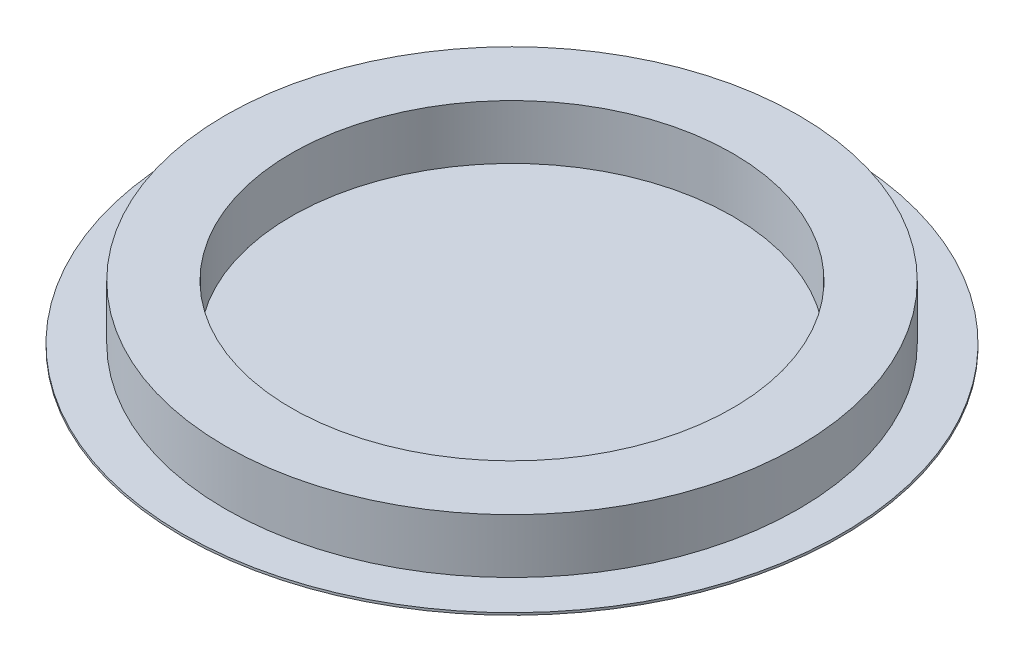
ISO-10303-21;
HEADER;
FILE_DESCRIPTION(('STEP AP214'),'2;1');
FILE_NAME('part.step','',(''),(''),'','','');
FILE_SCHEMA(('AUTOMOTIVE_DESIGN { 1 0 10303 214 1 1 1 1 }'));
ENDSEC;
DATA;
#1=APPLICATION_CONTEXT('core data for automotive mechanical design processes');
#2=APPLICATION_PROTOCOL_DEFINITION('international standard','automotive_design',2000,#1);
#3=PRODUCT_CONTEXT('',#1,'mechanical');
#4=PRODUCT('Part','Part','',(#3));
#5=PRODUCT_RELATED_PRODUCT_CATEGORY('part','',(#4));
#6=PRODUCT_DEFINITION_FORMATION('','',#4);
#7=PRODUCT_DEFINITION_CONTEXT('part definition',#1,'design');
#8=PRODUCT_DEFINITION('design','',#6,#7);
#9=PRODUCT_DEFINITION_SHAPE('','',#8);
#10=(LENGTH_UNIT() NAMED_UNIT(*) SI_UNIT(.MILLI.,.METRE.));
#11=(NAMED_UNIT(*) PLANE_ANGLE_UNIT() SI_UNIT($,.RADIAN.));
#12=(NAMED_UNIT(*) SI_UNIT($,.STERADIAN.) SOLID_ANGLE_UNIT());
#13=UNCERTAINTY_MEASURE_WITH_UNIT(LENGTH_MEASURE(1.E-05),#10,'distance_accuracy_value','');
#14=(GEOMETRIC_REPRESENTATION_CONTEXT(3) GLOBAL_UNCERTAINTY_ASSIGNED_CONTEXT((#13)) GLOBAL_UNIT_ASSIGNED_CONTEXT((#10,
#11,#12)) REPRESENTATION_CONTEXT('',''));
#15=CARTESIAN_POINT('',(0.,0.,0.));
#16=DIRECTION('',(0.,0.,1.));
#17=DIRECTION('',(1.,0.,0.));
#18=AXIS2_PLACEMENT_3D('',#15,#16,#17);
#19=CARTESIAN_POINT('',(0.,0.08,0.));
#20=DIRECTION('',(0.,-1.,0.));
#21=DIRECTION('',(0.,0.,-1.));
#22=AXIS2_PLACEMENT_3D('',#19,#20,#21);
#23=CYLINDRICAL_SURFACE('',#22,11.5);
#24=CARTESIAN_POINT('',(0.,0.08,0.));
#25=DIRECTION('',(0.,1.,0.));
#26=DIRECTION('',(0.,0.,1.));
#27=AXIS2_PLACEMENT_3D('',#24,#25,#26);
#28=CIRCLE('',#27,11.5);
#29=CARTESIAN_POINT('',(0.,0.08,-11.5));
#30=VERTEX_POINT('',#29);
#31=EDGE_CURVE('E45',#30,#30,#28,.T.);
#32=CARTESIAN_POINT('',(0.,0.,0.));
#33=DIRECTION('',(0.,1.,0.));
#34=DIRECTION('',(0.,0.,1.));
#35=AXIS2_PLACEMENT_3D('',#32,#33,#34);
#36=CIRCLE('',#35,11.5);
#37=CARTESIAN_POINT('',(0.,0.,-11.5));
#38=VERTEX_POINT('',#37);
#39=EDGE_CURVE('E49',#38,#38,#36,.T.);
#40=CARTESIAN_POINT('',(0.,0.08,-11.5));
#41=CARTESIAN_POINT('',(0.,0.0791666666666667,-11.5));
#42=CARTESIAN_POINT('',(0.,0.0783333333333333,-11.5));
#43=CARTESIAN_POINT('',(0.,0.0766666666666667,-11.5));
#44=CARTESIAN_POINT('',(0.,0.0758333333333333,-11.5));
#45=CARTESIAN_POINT('',(0.,0.0741666666666667,-11.5));
#46=CARTESIAN_POINT('',(0.,0.0733333333333333,-11.5));
#47=CARTESIAN_POINT('',(0.,0.0716666666666667,-11.5));
#48=CARTESIAN_POINT('',(0.,0.0708333333333333,-11.5));
#49=CARTESIAN_POINT('',(0.,0.0691666666666667,-11.5));
#50=CARTESIAN_POINT('',(0.,0.0683333333333333,-11.5));
#51=CARTESIAN_POINT('',(0.,0.0666666666666667,-11.5));
#52=CARTESIAN_POINT('',(0.,0.0658333333333333,-11.5));
#53=CARTESIAN_POINT('',(0.,0.0641666666666667,-11.5));
#54=CARTESIAN_POINT('',(0.,0.0633333333333333,-11.5));
#55=CARTESIAN_POINT('',(0.,0.0616666666666667,-11.5));
#56=CARTESIAN_POINT('',(0.,0.0608333333333333,-11.5));
#57=CARTESIAN_POINT('',(0.,0.0591666666666667,-11.5));
#58=CARTESIAN_POINT('',(0.,0.0583333333333333,-11.5));
#59=CARTESIAN_POINT('',(0.,0.0566666666666667,-11.5));
#60=CARTESIAN_POINT('',(0.,0.0558333333333333,-11.5));
#61=CARTESIAN_POINT('',(0.,0.0541666666666667,-11.5));
#62=CARTESIAN_POINT('',(0.,0.0533333333333333,-11.5));
#63=CARTESIAN_POINT('',(0.,0.0516666666666667,-11.5));
#64=CARTESIAN_POINT('',(0.,0.0508333333333333,-11.5));
#65=CARTESIAN_POINT('',(0.,0.0491666666666667,-11.5));
#66=CARTESIAN_POINT('',(0.,0.0483333333333333,-11.5));
#67=CARTESIAN_POINT('',(0.,0.0466666666666667,-11.5));
#68=CARTESIAN_POINT('',(0.,0.0458333333333333,-11.5));
#69=CARTESIAN_POINT('',(0.,0.0441666666666667,-11.5));
#70=CARTESIAN_POINT('',(0.,0.0433333333333333,-11.5));
#71=CARTESIAN_POINT('',(0.,0.0416666666666667,-11.5));
#72=CARTESIAN_POINT('',(0.,0.0408333333333333,-11.5));
#73=CARTESIAN_POINT('',(0.,0.0391666666666667,-11.5));
#74=CARTESIAN_POINT('',(0.,0.0383333333333333,-11.5));
#75=CARTESIAN_POINT('',(0.,0.0366666666666667,-11.5));
#76=CARTESIAN_POINT('',(0.,0.0358333333333333,-11.5));
#77=CARTESIAN_POINT('',(0.,0.0341666666666667,-11.5));
#78=CARTESIAN_POINT('',(0.,0.0333333333333333,-11.5));
#79=CARTESIAN_POINT('',(0.,0.0316666666666667,-11.5));
#80=CARTESIAN_POINT('',(0.,0.0308333333333333,-11.5));
#81=CARTESIAN_POINT('',(0.,0.0291666666666667,-11.5));
#82=CARTESIAN_POINT('',(0.,0.0283333333333333,-11.5));
#83=CARTESIAN_POINT('',(0.,0.0266666666666667,-11.5));
#84=CARTESIAN_POINT('',(0.,0.0258333333333333,-11.5));
#85=CARTESIAN_POINT('',(0.,0.0241666666666667,-11.5));
#86=CARTESIAN_POINT('',(0.,0.0233333333333333,-11.5));
#87=CARTESIAN_POINT('',(0.,0.0216666666666667,-11.5));
#88=CARTESIAN_POINT('',(0.,0.0208333333333333,-11.5));
#89=CARTESIAN_POINT('',(0.,0.0191666666666667,-11.5));
#90=CARTESIAN_POINT('',(0.,0.0183333333333333,-11.5));
#91=CARTESIAN_POINT('',(0.,0.0166666666666667,-11.5));
#92=CARTESIAN_POINT('',(0.,0.0158333333333333,-11.5));
#93=CARTESIAN_POINT('',(0.,0.0141666666666667,-11.5));
#94=CARTESIAN_POINT('',(0.,0.0133333333333333,-11.5));
#95=CARTESIAN_POINT('',(0.,0.0116666666666667,-11.5));
#96=CARTESIAN_POINT('',(0.,0.0108333333333333,-11.5));
#97=CARTESIAN_POINT('',(0.,0.00916666666666667,-11.5));
#98=CARTESIAN_POINT('',(0.,0.00833333333333334,-11.5));
#99=CARTESIAN_POINT('',(0.,0.00666666666666667,-11.5));
#100=CARTESIAN_POINT('',(0.,0.00583333333333333,-11.5));
#101=CARTESIAN_POINT('',(0.,0.00416666666666667,-11.5));
#102=CARTESIAN_POINT('',(0.,0.00333333333333334,-11.5));
#103=CARTESIAN_POINT('',(0.,0.00166666666666667,-11.5));
#104=CARTESIAN_POINT('',(0.,0.000833333333333335,-11.5));
#105=CARTESIAN_POINT('',(0.,0.,-11.5));
#106=B_SPLINE_CURVE_WITH_KNOTS('',3,(#40,#41,#42,#43,#44,#45,#46,#47,#48,#49,#50,#51,#52,#53,
#54,#55,#56,#57,#58,#59,#60,#61,#62,#63,#64,#65,#66,#67,#68,#69,#70,#71,#72,#73,#74,#75,#76,#77,
#78,#79,#80,#81,#82,#83,#84,#85,#86,#87,#88,#89,#90,#91,#92,#93,#94,#95,#96,#97,#98,#99,#100,
#101,#102,#103,#104,#105),.UNSPECIFIED.,.F.,.F.,(4,2,2,2,2,2,2,2,2,2,2,2,2,2,2,2,2,2,2,2,2,2,2,
2,2,2,2,2,2,2,2,2,4),(0.,0.00250000000000001,0.00500000000000001,0.00750000000000001,0.01,
0.0125,0.015,0.0175,0.02,0.0225,0.025,0.0275,0.03,0.0325,0.035,0.0375,0.04,0.0425,0.045,0.0475,
0.05,0.0525,0.055,0.0575,0.06,0.0625,0.065,0.0675,0.07,0.0725,0.075,0.0775,0.08),.UNSPECIFIED.);
#107=EDGE_CURVE('BSEAM39',#30,#38,#106,.T.);
#108=ORIENTED_EDGE('',*,*,#31,.F.);
#109=ORIENTED_EDGE('',*,*,#39,.T.);
#110=ORIENTED_EDGE('',*,*,#107,.T.);
#111=ORIENTED_EDGE('',*,*,#107,.F.);
#112=EDGE_LOOP('',(#108,#110,#109,#111));
#113=FACE_BOUND('',#112,.T.);
#114=ADVANCED_FACE('F39',(#113),#23,.T.);
#115=CARTESIAN_POINT('',(0.,0.08,0.));
#116=DIRECTION('',(0.,1.,0.));
#117=DIRECTION('',(0.,0.,1.));
#118=AXIS2_PLACEMENT_3D('',#115,#116,#117);
#119=PLANE('',#118);
#120=CARTESIAN_POINT('',(0.,0.08,0.));
#121=DIRECTION('',(0.,1.,0.));
#122=DIRECTION('',(0.,0.,1.));
#123=AXIS2_PLACEMENT_3D('',#120,#121,#122);
#124=CIRCLE('',#123,10.);
#125=CARTESIAN_POINT('',(0.,0.08,-10.));
#126=VERTEX_POINT('',#125);
#127=EDGE_CURVE('E56',#126,#126,#124,.T.);
#128=ORIENTED_EDGE('',*,*,#127,.F.);
#129=EDGE_LOOP('',(#128));
#130=FACE_BOUND('',#129,.T.);
#131=ORIENTED_EDGE('',*,*,#31,.T.);
#132=EDGE_LOOP('',(#131));
#133=FACE_BOUND('',#132,.T.);
#134=ADVANCED_FACE('F80',(#130,#133),#119,.T.);
#135=CARTESIAN_POINT('',(0.,0.,0.));
#136=DIRECTION('',(0.,1.,0.));
#137=DIRECTION('',(0.,0.,1.));
#138=AXIS2_PLACEMENT_3D('',#135,#136,#137);
#139=PLANE('',#138);
#140=ORIENTED_EDGE('',*,*,#39,.F.);
#141=EDGE_LOOP('',(#140));
#142=FACE_BOUND('',#141,.T.);
#143=ADVANCED_FACE('F70',(#142),#139,.F.);
#144=CARTESIAN_POINT('',(0.,1.98,0.));
#145=DIRECTION('',(0.,1.,0.));
#146=DIRECTION('',(0.,0.,1.));
#147=AXIS2_PLACEMENT_3D('',#144,#145,#146);
#148=PLANE('',#147);
#149=CARTESIAN_POINT('',(0.,1.98,0.));
#150=DIRECTION('',(0.,1.,0.));
#151=DIRECTION('',(0.,0.,1.));
#152=AXIS2_PLACEMENT_3D('',#149,#150,#151);
#153=CIRCLE('',#152,10.);
#154=CARTESIAN_POINT('',(0.,1.98,-10.));
#155=VERTEX_POINT('',#154);
#156=EDGE_CURVE('E54',#155,#155,#153,.T.);
#157=ORIENTED_EDGE('',*,*,#156,.T.);
#158=EDGE_LOOP('',(#157));
#159=FACE_BOUND('',#158,.T.);
#160=CARTESIAN_POINT('',(0.,1.98,0.));
#161=DIRECTION('',(0.,1.,0.));
#162=DIRECTION('',(0.,0.,1.));
#163=AXIS2_PLACEMENT_3D('',#160,#161,#162);
#164=CIRCLE('',#163,7.7);
#165=CARTESIAN_POINT('',(0.,1.98,-7.7));
#166=VERTEX_POINT('',#165);
#167=EDGE_CURVE('E59',#166,#166,#164,.T.);
#168=ORIENTED_EDGE('',*,*,#167,.F.);
#169=EDGE_LOOP('',(#168));
#170=FACE_BOUND('',#169,.T.);
#171=ADVANCED_FACE('F67',(#159,#170),#148,.T.);
#172=CARTESIAN_POINT('',(0.,1.98,0.));
#173=DIRECTION('',(0.,-1.,0.));
#174=DIRECTION('',(0.,0.,-1.));
#175=AXIS2_PLACEMENT_3D('',#172,#173,#174);
#176=CYLINDRICAL_SURFACE('',#175,10.);
#177=CARTESIAN_POINT('',(0.,1.98,-10.));
#178=CARTESIAN_POINT('',(0.,1.96020833333333,-10.));
#179=CARTESIAN_POINT('',(0.,1.94041666666667,-10.));
#180=CARTESIAN_POINT('',(0.,1.90083333333333,-10.));
#181=CARTESIAN_POINT('',(0.,1.88104166666667,-10.));
#182=CARTESIAN_POINT('',(0.,1.84145833333333,-10.));
#183=CARTESIAN_POINT('',(0.,1.82166666666667,-10.));
#184=CARTESIAN_POINT('',(0.,1.78208333333333,-10.));
#185=CARTESIAN_POINT('',(0.,1.76229166666667,-10.));
#186=CARTESIAN_POINT('',(0.,1.72270833333333,-10.));
#187=CARTESIAN_POINT('',(0.,1.70291666666667,-10.));
#188=CARTESIAN_POINT('',(0.,1.66333333333333,-10.));
#189=CARTESIAN_POINT('',(0.,1.64354166666667,-10.));
#190=CARTESIAN_POINT('',(0.,1.60395833333333,-10.));
#191=CARTESIAN_POINT('',(0.,1.58416666666667,-10.));
#192=CARTESIAN_POINT('',(0.,1.54458333333333,-10.));
#193=CARTESIAN_POINT('',(0.,1.52479166666667,-10.));
#194=CARTESIAN_POINT('',(0.,1.48520833333333,-10.));
#195=CARTESIAN_POINT('',(0.,1.46541666666667,-10.));
#196=CARTESIAN_POINT('',(0.,1.42583333333333,-10.));
#197=CARTESIAN_POINT('',(0.,1.40604166666667,-10.));
#198=CARTESIAN_POINT('',(0.,1.36645833333333,-10.));
#199=CARTESIAN_POINT('',(0.,1.34666666666667,-10.));
#200=CARTESIAN_POINT('',(0.,1.30708333333333,-10.));
#201=CARTESIAN_POINT('',(0.,1.28729166666667,-10.));
#202=CARTESIAN_POINT('',(0.,1.24770833333333,-10.));
#203=CARTESIAN_POINT('',(0.,1.22791666666667,-10.));
#204=CARTESIAN_POINT('',(0.,1.18833333333333,-10.));
#205=CARTESIAN_POINT('',(0.,1.16854166666667,-10.));
#206=CARTESIAN_POINT('',(0.,1.12895833333333,-10.));
#207=CARTESIAN_POINT('',(0.,1.10916666666667,-10.));
#208=CARTESIAN_POINT('',(0.,1.06958333333333,-10.));
#209=CARTESIAN_POINT('',(0.,1.04979166666667,-10.));
#210=CARTESIAN_POINT('',(0.,1.01020833333333,-10.));
#211=CARTESIAN_POINT('',(0.,0.990416666666667,-10.));
#212=CARTESIAN_POINT('',(0.,0.950833333333333,-10.));
#213=CARTESIAN_POINT('',(0.,0.931041666666667,-10.));
#214=CARTESIAN_POINT('',(0.,0.891458333333333,-10.));
#215=CARTESIAN_POINT('',(0.,0.871666666666667,-10.));
#216=CARTESIAN_POINT('',(0.,0.832083333333333,-10.));
#217=CARTESIAN_POINT('',(0.,0.812291666666667,-10.));
#218=CARTESIAN_POINT('',(0.,0.772708333333333,-10.));
#219=CARTESIAN_POINT('',(0.,0.752916666666667,-10.));
#220=CARTESIAN_POINT('',(0.,0.713333333333333,-10.));
#221=CARTESIAN_POINT('',(0.,0.693541666666667,-10.));
#222=CARTESIAN_POINT('',(0.,0.653958333333333,-10.));
#223=CARTESIAN_POINT('',(0.,0.634166666666667,-10.));
#224=CARTESIAN_POINT('',(0.,0.594583333333333,-10.));
#225=CARTESIAN_POINT('',(0.,0.574791666666667,-10.));
#226=CARTESIAN_POINT('',(0.,0.535208333333333,-10.));
#227=CARTESIAN_POINT('',(0.,0.515416666666667,-10.));
#228=CARTESIAN_POINT('',(0.,0.475833333333333,-10.));
#229=CARTESIAN_POINT('',(0.,0.456041666666667,-10.));
#230=CARTESIAN_POINT('',(0.,0.416458333333333,-10.));
#231=CARTESIAN_POINT('',(0.,0.396666666666667,-10.));
#232=CARTESIAN_POINT('',(0.,0.357083333333333,-10.));
#233=CARTESIAN_POINT('',(0.,0.337291666666667,-10.));
#234=CARTESIAN_POINT('',(0.,0.297708333333333,-10.));
#235=CARTESIAN_POINT('',(0.,0.277916666666667,-10.));
#236=CARTESIAN_POINT('',(0.,0.238333333333333,-10.));
#237=CARTESIAN_POINT('',(0.,0.218541666666667,-10.));
#238=CARTESIAN_POINT('',(0.,0.178958333333333,-10.));
#239=CARTESIAN_POINT('',(0.,0.159166666666667,-10.));
#240=CARTESIAN_POINT('',(0.,0.119583333333333,-10.));
#241=CARTESIAN_POINT('',(0.,0.0997916666666666,-10.));
#242=CARTESIAN_POINT('',(0.,0.08,-10.));
#243=B_SPLINE_CURVE_WITH_KNOTS('',3,(#177,#178,#179,#180,#181,#182,#183,#184,#185,#186,#187,
#188,#189,#190,#191,#192,#193,#194,#195,#196,#197,#198,#199,#200,#201,#202,#203,#204,#205,#206,
#207,#208,#209,#210,#211,#212,#213,#214,#215,#216,#217,#218,#219,#220,#221,#222,#223,#224,#225,
#226,#227,#228,#229,#230,#231,#232,#233,#234,#235,#236,#237,#238,#239,#240,#241,#242),
.UNSPECIFIED.,.F.,.F.,(4,2,2,2,2,2,2,2,2,2,2,2,2,2,2,2,2,2,2,2,2,2,2,2,2,2,2,2,2,2,2,2,4),(0.,
0.0593749999999997,0.11875,0.178125,0.2375,0.296875,0.35625,0.415625,0.475,0.534375,0.59375,
0.653125,0.7125,0.771875,0.831249999999999,0.890625,0.95,1.009375,1.06875,1.128125,1.1875,
1.246875,1.30625,1.365625,1.425,1.484375,1.54375,1.603125,1.6625,1.721875,1.78125,1.840625,1.9),.UNSPECIFIED.);
#244=EDGE_CURVE('BSEAM69',#155,#126,#243,.T.);
#245=ORIENTED_EDGE('',*,*,#156,.F.);
#246=ORIENTED_EDGE('',*,*,#127,.T.);
#247=ORIENTED_EDGE('',*,*,#244,.T.);
#248=ORIENTED_EDGE('',*,*,#244,.F.);
#249=EDGE_LOOP('',(#245,#247,#246,#248));
#250=FACE_BOUND('',#249,.T.);
#251=ADVANCED_FACE('F69',(#250),#176,.T.);
#252=CARTESIAN_POINT('',(0.,1.98,0.));
#253=DIRECTION('',(0.,-1.,0.));
#254=DIRECTION('',(0.,0.,-1.));
#255=AXIS2_PLACEMENT_3D('',#252,#253,#254);
#256=CYLINDRICAL_SURFACE('',#255,7.7);
#257=CARTESIAN_POINT('',(0.,0.08,0.));
#258=DIRECTION('',(0.,1.,0.));
#259=DIRECTION('',(0.,0.,1.));
#260=AXIS2_PLACEMENT_3D('',#257,#258,#259);
#261=CIRCLE('',#260,7.7);
#262=CARTESIAN_POINT('',(0.,0.08,-7.7));
#263=VERTEX_POINT('',#262);
#264=EDGE_CURVE('E10',#263,#263,#261,.F.);
#265=CARTESIAN_POINT('',(0.,1.98,-7.7));
#266=CARTESIAN_POINT('',(0.,1.96020833333333,-7.7));
#267=CARTESIAN_POINT('',(0.,1.94041666666667,-7.7));
#268=CARTESIAN_POINT('',(0.,1.90083333333333,-7.7));
#269=CARTESIAN_POINT('',(0.,1.88104166666667,-7.7));
#270=CARTESIAN_POINT('',(0.,1.84145833333333,-7.7));
#271=CARTESIAN_POINT('',(0.,1.82166666666667,-7.7));
#272=CARTESIAN_POINT('',(0.,1.78208333333333,-7.7));
#273=CARTESIAN_POINT('',(0.,1.76229166666667,-7.7));
#274=CARTESIAN_POINT('',(0.,1.72270833333333,-7.7));
#275=CARTESIAN_POINT('',(0.,1.70291666666667,-7.7));
#276=CARTESIAN_POINT('',(0.,1.66333333333333,-7.7));
#277=CARTESIAN_POINT('',(0.,1.64354166666667,-7.7));
#278=CARTESIAN_POINT('',(0.,1.60395833333333,-7.7));
#279=CARTESIAN_POINT('',(0.,1.58416666666667,-7.7));
#280=CARTESIAN_POINT('',(0.,1.54458333333333,-7.7));
#281=CARTESIAN_POINT('',(0.,1.52479166666667,-7.7));
#282=CARTESIAN_POINT('',(0.,1.48520833333333,-7.7));
#283=CARTESIAN_POINT('',(0.,1.46541666666667,-7.7));
#284=CARTESIAN_POINT('',(0.,1.42583333333333,-7.7));
#285=CARTESIAN_POINT('',(0.,1.40604166666667,-7.7));
#286=CARTESIAN_POINT('',(0.,1.36645833333333,-7.7));
#287=CARTESIAN_POINT('',(0.,1.34666666666667,-7.7));
#288=CARTESIAN_POINT('',(0.,1.30708333333333,-7.7));
#289=CARTESIAN_POINT('',(0.,1.28729166666667,-7.7));
#290=CARTESIAN_POINT('',(0.,1.24770833333333,-7.7));
#291=CARTESIAN_POINT('',(0.,1.22791666666667,-7.7));
#292=CARTESIAN_POINT('',(0.,1.18833333333333,-7.7));
#293=CARTESIAN_POINT('',(0.,1.16854166666667,-7.7));
#294=CARTESIAN_POINT('',(0.,1.12895833333333,-7.7));
#295=CARTESIAN_POINT('',(0.,1.10916666666667,-7.7));
#296=CARTESIAN_POINT('',(0.,1.06958333333333,-7.7));
#297=CARTESIAN_POINT('',(0.,1.04979166666667,-7.7));
#298=CARTESIAN_POINT('',(0.,1.01020833333333,-7.7));
#299=CARTESIAN_POINT('',(0.,0.990416666666667,-7.7));
#300=CARTESIAN_POINT('',(0.,0.950833333333333,-7.7));
#301=CARTESIAN_POINT('',(0.,0.931041666666667,-7.7));
#302=CARTESIAN_POINT('',(0.,0.891458333333333,-7.7));
#303=CARTESIAN_POINT('',(0.,0.871666666666667,-7.7));
#304=CARTESIAN_POINT('',(0.,0.832083333333333,-7.7));
#305=CARTESIAN_POINT('',(0.,0.812291666666667,-7.7));
#306=CARTESIAN_POINT('',(0.,0.772708333333333,-7.7));
#307=CARTESIAN_POINT('',(0.,0.752916666666667,-7.7));
#308=CARTESIAN_POINT('',(0.,0.713333333333333,-7.7));
#309=CARTESIAN_POINT('',(0.,0.693541666666667,-7.7));
#310=CARTESIAN_POINT('',(0.,0.653958333333333,-7.7));
#311=CARTESIAN_POINT('',(0.,0.634166666666667,-7.7));
#312=CARTESIAN_POINT('',(0.,0.594583333333333,-7.7));
#313=CARTESIAN_POINT('',(0.,0.574791666666667,-7.7));
#314=CARTESIAN_POINT('',(0.,0.535208333333333,-7.7));
#315=CARTESIAN_POINT('',(0.,0.515416666666667,-7.7));
#316=CARTESIAN_POINT('',(0.,0.475833333333333,-7.7));
#317=CARTESIAN_POINT('',(0.,0.456041666666667,-7.7));
#318=CARTESIAN_POINT('',(0.,0.416458333333333,-7.7));
#319=CARTESIAN_POINT('',(0.,0.396666666666667,-7.7));
#320=CARTESIAN_POINT('',(0.,0.357083333333333,-7.7));
#321=CARTESIAN_POINT('',(0.,0.337291666666667,-7.7));
#322=CARTESIAN_POINT('',(0.,0.297708333333333,-7.7));
#323=CARTESIAN_POINT('',(0.,0.277916666666667,-7.7));
#324=CARTESIAN_POINT('',(0.,0.238333333333333,-7.7));
#325=CARTESIAN_POINT('',(0.,0.218541666666667,-7.7));
#326=CARTESIAN_POINT('',(0.,0.178958333333333,-7.7));
#327=CARTESIAN_POINT('',(0.,0.159166666666667,-7.7));
#328=CARTESIAN_POINT('',(0.,0.119583333333333,-7.7));
#329=CARTESIAN_POINT('',(0.,0.0997916666666666,-7.7));
#330=CARTESIAN_POINT('',(0.,0.08,-7.7));
#331=B_SPLINE_CURVE_WITH_KNOTS('',3,(#265,#266,#267,#268,#269,#270,#271,#272,#273,#274,#275,
#276,#277,#278,#279,#280,#281,#282,#283,#284,#285,#286,#287,#288,#289,#290,#291,#292,#293,#294,
#295,#296,#297,#298,#299,#300,#301,#302,#303,#304,#305,#306,#307,#308,#309,#310,#311,#312,#313,
#314,#315,#316,#317,#318,#319,#320,#321,#322,#323,#324,#325,#326,#327,#328,#329,#330),
.UNSPECIFIED.,.F.,.F.,(4,2,2,2,2,2,2,2,2,2,2,2,2,2,2,2,2,2,2,2,2,2,2,2,2,2,2,2,2,2,2,2,4),(0.,
0.0593749999999997,0.11875,0.178125,0.2375,0.296875,0.35625,0.415625,0.475,0.534375,0.59375,
0.653125,0.7125,0.771875,0.831249999999999,0.890625,0.95,1.009375,1.06875,1.128125,1.1875,
1.246875,1.30625,1.365625,1.425,1.484375,1.54375,1.603125,1.6625,1.721875,1.78125,1.840625,1.9),.UNSPECIFIED.);
#332=EDGE_CURVE('BSEAM65',#166,#263,#331,.T.);
#333=ORIENTED_EDGE('',*,*,#167,.T.);
#334=ORIENTED_EDGE('',*,*,#264,.T.);
#335=ORIENTED_EDGE('',*,*,#332,.T.);
#336=ORIENTED_EDGE('',*,*,#332,.F.);
#337=EDGE_LOOP('',(#333,#335,#334,#336));
#338=FACE_BOUND('',#337,.T.);
#339=ADVANCED_FACE('F65',(#338),#256,.F.);
#340=ORIENTED_EDGE('',*,*,#264,.F.);
#341=EDGE_LOOP('',(#340));
#342=FACE_BOUND('',#341,.T.);
#343=ADVANCED_FACE('F89',(#342),#119,.T.);
#344=CLOSED_SHELL('',(#114,#134,#143,#171,#251,#339,#343));
#345=MANIFOLD_SOLID_BREP('B2',#344);
#346=ADVANCED_BREP_SHAPE_REPRESENTATION('',(#18,#345),#14);
#347=SHAPE_DEFINITION_REPRESENTATION(#9,#346);
ENDSEC;
END-ISO-10303-21;
